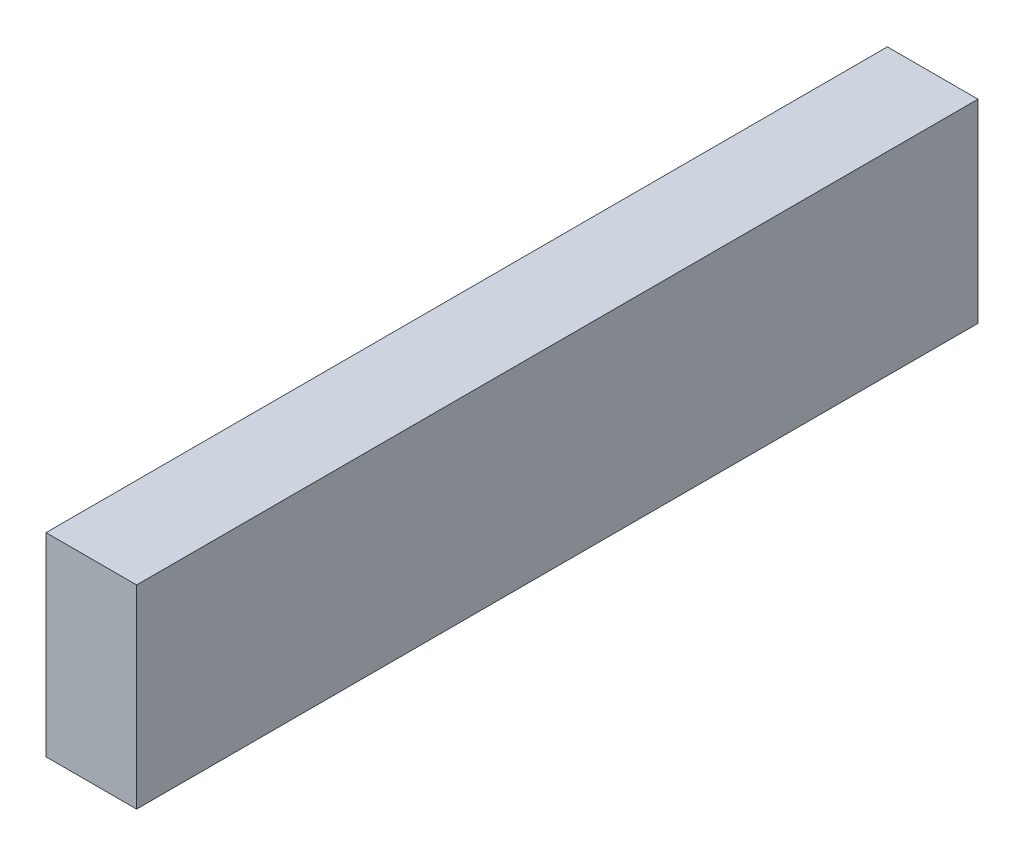
ISO-10303-21;
HEADER;
FILE_DESCRIPTION(('STEP AP214'),'2;1');
FILE_NAME('part.step','',(''),(''),'','','');
FILE_SCHEMA(('AUTOMOTIVE_DESIGN { 1 0 10303 214 1 1 1 1 }'));
ENDSEC;
DATA;
#1=APPLICATION_CONTEXT('core data for automotive mechanical design processes');
#2=APPLICATION_PROTOCOL_DEFINITION('international standard','automotive_design',2000,#1);
#3=PRODUCT_CONTEXT('',#1,'mechanical');
#4=PRODUCT('Part','Part','',(#3));
#5=PRODUCT_RELATED_PRODUCT_CATEGORY('part','',(#4));
#6=PRODUCT_DEFINITION_FORMATION('','',#4);
#7=PRODUCT_DEFINITION_CONTEXT('part definition',#1,'design');
#8=PRODUCT_DEFINITION('design','',#6,#7);
#9=PRODUCT_DEFINITION_SHAPE('','',#8);
#10=(LENGTH_UNIT() NAMED_UNIT(*) SI_UNIT(.MILLI.,.METRE.));
#11=(NAMED_UNIT(*) PLANE_ANGLE_UNIT() SI_UNIT($,.RADIAN.));
#12=(NAMED_UNIT(*) SI_UNIT($,.STERADIAN.) SOLID_ANGLE_UNIT());
#13=UNCERTAINTY_MEASURE_WITH_UNIT(LENGTH_MEASURE(1.E-05),#10,'distance_accuracy_value','');
#14=(GEOMETRIC_REPRESENTATION_CONTEXT(3) GLOBAL_UNCERTAINTY_ASSIGNED_CONTEXT((#13)) GLOBAL_UNIT_ASSIGNED_CONTEXT((#10,
#11,#12)) REPRESENTATION_CONTEXT('',''));
#15=CARTESIAN_POINT('',(0.,0.,0.));
#16=DIRECTION('',(0.,0.,1.));
#17=DIRECTION('',(1.,0.,0.));
#18=AXIS2_PLACEMENT_3D('',#15,#16,#17);
#19=CARTESIAN_POINT('',(-47.6428571428571,20.0892857142857,65.));
#20=DIRECTION('',(-1.,0.,0.));
#21=DIRECTION('',(0.,-1.,0.));
#22=AXIS2_PLACEMENT_3D('',#19,#20,#21);
#23=PLANE('',#22);
#24=DIRECTION('',(0.,1.,0.));
#25=VECTOR('',#24,1.);
#26=CARTESIAN_POINT('',(-47.6428571428571,20.0892857142857,0.));
#27=LINE('',#26,#25);
#28=CARTESIAN_POINT('',(-47.6428571428571,5.08928571428571,0.));
#29=VERTEX_POINT('',#28);
#30=CARTESIAN_POINT('',(-47.6428571428571,20.0892857142857,0.));
#31=VERTEX_POINT('',#30);
#32=EDGE_CURVE('E107',#29,#31,#27,.T.);
#33=ORIENTED_EDGE('',*,*,#32,.T.);
#34=DIRECTION('',(0.,0.,-1.));
#35=VECTOR('',#34,1.);
#36=CARTESIAN_POINT('',(-47.6428571428571,20.0892857142857,65.));
#37=LINE('',#36,#35);
#38=CARTESIAN_POINT('',(-47.6428571428571,20.0892857142857,65.));
#39=VERTEX_POINT('',#38);
#40=EDGE_CURVE('E11',#39,#31,#37,.T.);
#41=ORIENTED_EDGE('',*,*,#40,.F.);
#42=DIRECTION('',(0.,1.,0.));
#43=VECTOR('',#42,1.);
#44=CARTESIAN_POINT('',(-47.6428571428571,20.0892857142857,65.));
#45=LINE('',#44,#43);
#46=CARTESIAN_POINT('',(-47.6428571428571,5.08928571428571,65.));
#47=VERTEX_POINT('',#46);
#48=EDGE_CURVE('E91',#47,#39,#45,.T.);
#49=ORIENTED_EDGE('',*,*,#48,.F.);
#50=DIRECTION('',(0.,0.,-1.));
#51=VECTOR('',#50,1.);
#52=CARTESIAN_POINT('',(-47.6428571428571,5.08928571428571,65.));
#53=LINE('',#52,#51);
#54=EDGE_CURVE('E103',#47,#29,#53,.T.);
#55=ORIENTED_EDGE('',*,*,#54,.T.);
#56=EDGE_LOOP('',(#33,#41,#49,#55));
#57=FACE_BOUND('',#56,.T.);
#58=ADVANCED_FACE('F39',(#57),#23,.F.);
#59=CARTESIAN_POINT('',(-54.6428571428571,20.0892857142857,65.));
#60=DIRECTION('',(0.,-1.,0.));
#61=DIRECTION('',(0.,0.,-1.));
#62=AXIS2_PLACEMENT_3D('',#59,#60,#61);
#63=PLANE('',#62);
#64=DIRECTION('',(-1.,0.,0.));
#65=VECTOR('',#64,1.);
#66=CARTESIAN_POINT('',(-54.6428571428571,20.0892857142857,0.));
#67=LINE('',#66,#65);
#68=CARTESIAN_POINT('',(-54.6428571428571,20.0892857142857,0.));
#69=VERTEX_POINT('',#68);
#70=EDGE_CURVE('E96',#31,#69,#67,.T.);
#71=ORIENTED_EDGE('',*,*,#70,.T.);
#72=DIRECTION('',(0.,0.,-1.));
#73=VECTOR('',#72,1.);
#74=CARTESIAN_POINT('',(-54.6428571428571,20.0892857142857,65.));
#75=LINE('',#74,#73);
#76=CARTESIAN_POINT('',(-54.6428571428571,20.0892857142857,65.));
#77=VERTEX_POINT('',#76);
#78=EDGE_CURVE('E48',#77,#69,#75,.T.);
#79=ORIENTED_EDGE('',*,*,#78,.F.);
#80=DIRECTION('',(-1.,0.,0.));
#81=VECTOR('',#80,1.);
#82=CARTESIAN_POINT('',(-54.6428571428571,20.0892857142857,65.));
#83=LINE('',#82,#81);
#84=EDGE_CURVE('E86',#39,#77,#83,.T.);
#85=ORIENTED_EDGE('',*,*,#84,.F.);
#86=ORIENTED_EDGE('',*,*,#40,.T.);
#87=EDGE_LOOP('',(#71,#79,#85,#86));
#88=FACE_BOUND('',#87,.T.);
#89=ADVANCED_FACE('F95',(#88),#63,.F.);
#90=CARTESIAN_POINT('',(-54.6428571428571,20.0892857142857,65.));
#91=DIRECTION('',(1.,0.,0.));
#92=DIRECTION('',(0.,0.,-1.));
#93=AXIS2_PLACEMENT_3D('',#90,#91,#92);
#94=PLANE('',#93);
#95=DIRECTION('',(0.,-1.,0.));
#96=VECTOR('',#95,1.);
#97=CARTESIAN_POINT('',(-54.6428571428571,20.0892857142857,0.));
#98=LINE('',#97,#96);
#99=CARTESIAN_POINT('',(-54.6428571428571,5.08928571428571,0.));
#100=VERTEX_POINT('',#99);
#101=EDGE_CURVE('E73',#69,#100,#98,.T.);
#102=ORIENTED_EDGE('',*,*,#101,.T.);
#103=DIRECTION('',(0.,0.,-1.));
#104=VECTOR('',#103,1.);
#105=CARTESIAN_POINT('',(-54.6428571428571,5.08928571428571,65.));
#106=LINE('',#105,#104);
#107=CARTESIAN_POINT('',(-54.6428571428571,5.08928571428571,65.));
#108=VERTEX_POINT('',#107);
#109=EDGE_CURVE('E98',#108,#100,#106,.T.);
#110=ORIENTED_EDGE('',*,*,#109,.F.);
#111=DIRECTION('',(0.,-1.,0.));
#112=VECTOR('',#111,1.);
#113=CARTESIAN_POINT('',(-54.6428571428571,20.0892857142857,65.));
#114=LINE('',#113,#112);
#115=EDGE_CURVE('E89',#77,#108,#114,.T.);
#116=ORIENTED_EDGE('',*,*,#115,.F.);
#117=ORIENTED_EDGE('',*,*,#78,.T.);
#118=EDGE_LOOP('',(#102,#110,#116,#117));
#119=FACE_BOUND('',#118,.T.);
#120=ADVANCED_FACE('F99',(#119),#94,.F.);
#121=CARTESIAN_POINT('',(-54.6428571428571,5.08928571428571,65.));
#122=DIRECTION('',(0.,1.,0.));
#123=DIRECTION('',(-1.,0.,0.));
#124=AXIS2_PLACEMENT_3D('',#121,#122,#123);
#125=PLANE('',#124);
#126=DIRECTION('',(1.,0.,0.));
#127=VECTOR('',#126,1.);
#128=CARTESIAN_POINT('',(-54.6428571428571,5.08928571428571,0.));
#129=LINE('',#128,#127);
#130=EDGE_CURVE('E79',#100,#29,#129,.T.);
#131=ORIENTED_EDGE('',*,*,#130,.T.);
#132=ORIENTED_EDGE('',*,*,#54,.F.);
#133=DIRECTION('',(1.,0.,0.));
#134=VECTOR('',#133,1.);
#135=CARTESIAN_POINT('',(-54.6428571428571,5.08928571428571,65.));
#136=LINE('',#135,#134);
#137=EDGE_CURVE('E56',#108,#47,#136,.T.);
#138=ORIENTED_EDGE('',*,*,#137,.F.);
#139=ORIENTED_EDGE('',*,*,#109,.T.);
#140=EDGE_LOOP('',(#131,#132,#138,#139));
#141=FACE_BOUND('',#140,.T.);
#142=ADVANCED_FACE('F120',(#141),#125,.F.);
#143=CARTESIAN_POINT('',(0.,0.,65.));
#144=DIRECTION('',(0.,0.,1.));
#145=DIRECTION('',(1.,0.,0.));
#146=AXIS2_PLACEMENT_3D('',#143,#144,#145);
#147=PLANE('',#146);
#148=ORIENTED_EDGE('',*,*,#48,.T.);
#149=ORIENTED_EDGE('',*,*,#84,.T.);
#150=ORIENTED_EDGE('',*,*,#115,.T.);
#151=ORIENTED_EDGE('',*,*,#137,.T.);
#152=EDGE_LOOP('',(#148,#149,#150,#151));
#153=FACE_BOUND('',#152,.T.);
#154=ADVANCED_FACE('F87',(#153),#147,.T.);
#155=CARTESIAN_POINT('',(0.,0.,0.));
#156=DIRECTION('',(0.,0.,1.));
#157=DIRECTION('',(1.,0.,0.));
#158=AXIS2_PLACEMENT_3D('',#155,#156,#157);
#159=PLANE('',#158);
#160=ORIENTED_EDGE('',*,*,#32,.F.);
#161=ORIENTED_EDGE('',*,*,#130,.F.);
#162=ORIENTED_EDGE('',*,*,#101,.F.);
#163=ORIENTED_EDGE('',*,*,#70,.F.);
#164=EDGE_LOOP('',(#160,#161,#162,#163));
#165=FACE_BOUND('',#164,.T.);
#166=ADVANCED_FACE('F123',(#165),#159,.F.);
#167=CLOSED_SHELL('',(#58,#89,#120,#142,#154,#166));
#168=MANIFOLD_SOLID_BREP('B2',#167);
#169=ADVANCED_BREP_SHAPE_REPRESENTATION('',(#18,#168),#14);
#170=SHAPE_DEFINITION_REPRESENTATION(#9,#169);
ENDSEC;
END-ISO-10303-21;
